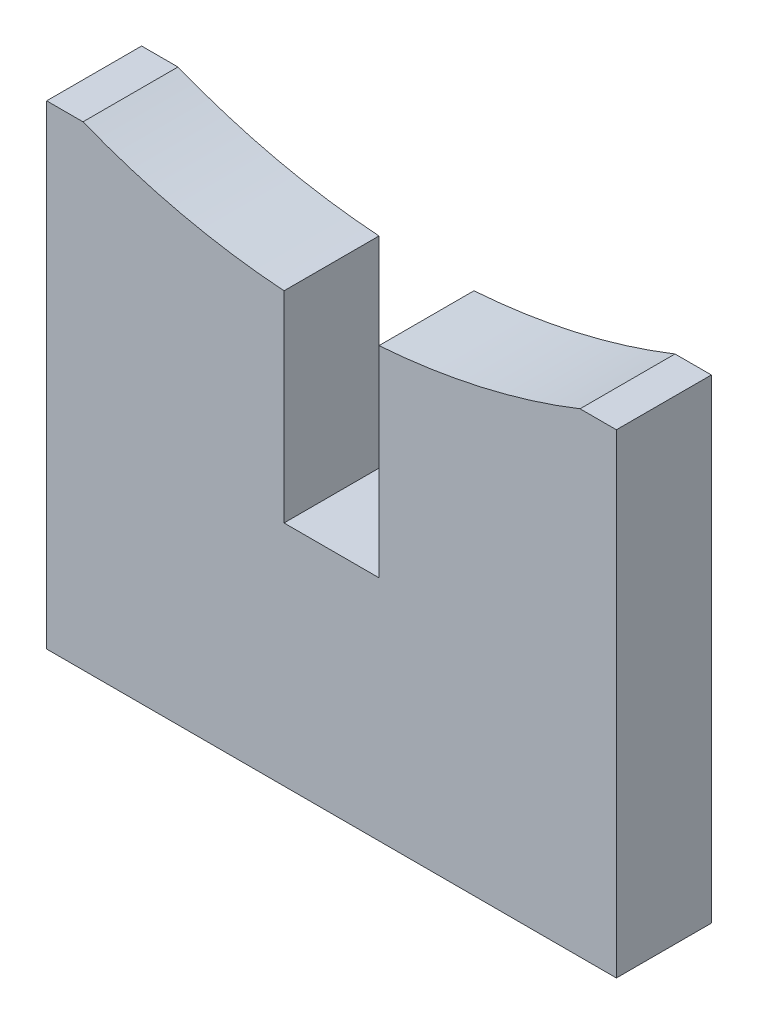
ISO-10303-21;
HEADER;
FILE_DESCRIPTION(('STEP AP214'),'2;1');
FILE_NAME('part.step','',(''),(''),'','','');
FILE_SCHEMA(('AUTOMOTIVE_DESIGN { 1 0 10303 214 1 1 1 1 }'));
ENDSEC;
DATA;
#1=APPLICATION_CONTEXT('core data for automotive mechanical design processes');
#2=APPLICATION_PROTOCOL_DEFINITION('international standard','automotive_design',2000,#1);
#3=PRODUCT_CONTEXT('',#1,'mechanical');
#4=PRODUCT('Part','Part','',(#3));
#5=PRODUCT_RELATED_PRODUCT_CATEGORY('part','',(#4));
#6=PRODUCT_DEFINITION_FORMATION('','',#4);
#7=PRODUCT_DEFINITION_CONTEXT('part definition',#1,'design');
#8=PRODUCT_DEFINITION('design','',#6,#7);
#9=PRODUCT_DEFINITION_SHAPE('','',#8);
#10=(LENGTH_UNIT() NAMED_UNIT(*) SI_UNIT(.MILLI.,.METRE.));
#11=(NAMED_UNIT(*) PLANE_ANGLE_UNIT() SI_UNIT($,.RADIAN.));
#12=(NAMED_UNIT(*) SI_UNIT($,.STERADIAN.) SOLID_ANGLE_UNIT());
#13=UNCERTAINTY_MEASURE_WITH_UNIT(LENGTH_MEASURE(1.E-05),#10,'distance_accuracy_value','');
#14=(GEOMETRIC_REPRESENTATION_CONTEXT(3) GLOBAL_UNCERTAINTY_ASSIGNED_CONTEXT((#13)) GLOBAL_UNIT_ASSIGNED_CONTEXT((#10,
#11,#12)) REPRESENTATION_CONTEXT('',''));
#15=CARTESIAN_POINT('',(0.,0.,0.));
#16=DIRECTION('',(0.,0.,1.));
#17=DIRECTION('',(1.,0.,0.));
#18=AXIS2_PLACEMENT_3D('',#15,#16,#17);
#19=CARTESIAN_POINT('',(0.,25.,5.));
#20=DIRECTION('',(0.,-1.,0.));
#21=DIRECTION('',(0.,0.,-1.));
#22=AXIS2_PLACEMENT_3D('',#19,#20,#21);
#23=PLANE('',#22);
#24=DIRECTION('',(-1.,0.,0.));
#25=VECTOR('',#24,1.);
#26=CARTESIAN_POINT('',(0.,25.,5.));
#27=LINE('',#26,#25);
#28=CARTESIAN_POINT('',(1.91374767169757,25.,5.));
#29=VERTEX_POINT('',#28);
#30=CARTESIAN_POINT('',(0.,25.,5.));
#31=VERTEX_POINT('',#30);
#32=EDGE_CURVE('E120',#29,#31,#27,.T.);
#33=ORIENTED_EDGE('',*,*,#32,.F.);
#34=DIRECTION('',(0.,0.,1.));
#35=VECTOR('',#34,1.);
#36=CARTESIAN_POINT('',(1.91374767169757,25.,-26.));
#37=LINE('',#36,#35);
#38=CARTESIAN_POINT('',(1.91374767169757,25.,0.));
#39=VERTEX_POINT('',#38);
#40=EDGE_CURVE('E106',#29,#39,#37,.F.);
#41=ORIENTED_EDGE('',*,*,#40,.T.);
#42=DIRECTION('',(-1.,0.,0.));
#43=VECTOR('',#42,1.);
#44=CARTESIAN_POINT('',(0.,25.,0.));
#45=LINE('',#44,#43);
#46=CARTESIAN_POINT('',(0.,25.,0.));
#47=VERTEX_POINT('',#46);
#48=EDGE_CURVE('E143',#39,#47,#45,.T.);
#49=ORIENTED_EDGE('',*,*,#48,.T.);
#50=DIRECTION('',(0.,0.,-1.));
#51=VECTOR('',#50,1.);
#52=CARTESIAN_POINT('',(0.,25.,5.));
#53=LINE('',#52,#51);
#54=EDGE_CURVE('E126',#31,#47,#53,.T.);
#55=ORIENTED_EDGE('',*,*,#54,.F.);
#56=EDGE_LOOP('',(#33,#41,#49,#55));
#57=FACE_BOUND('',#56,.T.);
#58=ADVANCED_FACE('F32',(#57),#23,.F.);
#59=CARTESIAN_POINT('',(0.,0.,5.));
#60=DIRECTION('',(1.,0.,0.));
#61=DIRECTION('',(0.,0.,-1.));
#62=AXIS2_PLACEMENT_3D('',#59,#60,#61);
#63=PLANE('',#62);
#64=DIRECTION('',(0.,-1.,0.));
#65=VECTOR('',#64,1.);
#66=CARTESIAN_POINT('',(0.,0.,0.));
#67=LINE('',#66,#65);
#68=CARTESIAN_POINT('',(0.,0.,0.));
#69=VERTEX_POINT('',#68);
#70=EDGE_CURVE('E135',#47,#69,#67,.T.);
#71=ORIENTED_EDGE('',*,*,#70,.T.);
#72=DIRECTION('',(0.,0.,-1.));
#73=VECTOR('',#72,1.);
#74=CARTESIAN_POINT('',(0.,0.,5.));
#75=LINE('',#74,#73);
#76=CARTESIAN_POINT('',(0.,0.,5.));
#77=VERTEX_POINT('',#76);
#78=EDGE_CURVE('E155',#77,#69,#75,.T.);
#79=ORIENTED_EDGE('',*,*,#78,.F.);
#80=DIRECTION('',(0.,-1.,0.));
#81=VECTOR('',#80,1.);
#82=CARTESIAN_POINT('',(0.,0.,5.));
#83=LINE('',#82,#81);
#84=EDGE_CURVE('E147',#31,#77,#83,.T.);
#85=ORIENTED_EDGE('',*,*,#84,.F.);
#86=ORIENTED_EDGE('',*,*,#54,.T.);
#87=EDGE_LOOP('',(#71,#79,#85,#86));
#88=FACE_BOUND('',#87,.T.);
#89=ADVANCED_FACE('F34',(#88),#63,.F.);
#90=CARTESIAN_POINT('',(0.,0.,5.));
#91=DIRECTION('',(0.,1.,0.));
#92=DIRECTION('',(0.,0.,1.));
#93=AXIS2_PLACEMENT_3D('',#90,#91,#92);
#94=PLANE('',#93);
#95=DIRECTION('',(1.,0.,0.));
#96=VECTOR('',#95,1.);
#97=CARTESIAN_POINT('',(0.,0.,0.));
#98=LINE('',#97,#96);
#99=CARTESIAN_POINT('',(30.,0.,0.));
#100=VERTEX_POINT('',#99);
#101=EDGE_CURVE('E138',#69,#100,#98,.T.);
#102=ORIENTED_EDGE('',*,*,#101,.T.);
#103=DIRECTION('',(0.,0.,-1.));
#104=VECTOR('',#103,1.);
#105=CARTESIAN_POINT('',(30.,0.,5.));
#106=LINE('',#105,#104);
#107=CARTESIAN_POINT('',(30.,0.,5.));
#108=VERTEX_POINT('',#107);
#109=EDGE_CURVE('E152',#108,#100,#106,.T.);
#110=ORIENTED_EDGE('',*,*,#109,.F.);
#111=DIRECTION('',(1.,0.,0.));
#112=VECTOR('',#111,1.);
#113=CARTESIAN_POINT('',(0.,0.,5.));
#114=LINE('',#113,#112);
#115=EDGE_CURVE('E131',#77,#108,#114,.T.);
#116=ORIENTED_EDGE('',*,*,#115,.F.);
#117=ORIENTED_EDGE('',*,*,#78,.T.);
#118=EDGE_LOOP('',(#102,#110,#116,#117));
#119=FACE_BOUND('',#118,.T.);
#120=ADVANCED_FACE('F196',(#119),#94,.F.);
#121=CARTESIAN_POINT('',(30.,0.,5.));
#122=DIRECTION('',(-1.,0.,0.));
#123=DIRECTION('',(0.,0.,1.));
#124=AXIS2_PLACEMENT_3D('',#121,#122,#123);
#125=PLANE('',#124);
#126=DIRECTION('',(0.,1.,0.));
#127=VECTOR('',#126,1.);
#128=CARTESIAN_POINT('',(30.,0.,0.));
#129=LINE('',#128,#127);
#130=CARTESIAN_POINT('',(30.,25.,0.));
#131=VERTEX_POINT('',#130);
#132=EDGE_CURVE('E141',#100,#131,#129,.T.);
#133=ORIENTED_EDGE('',*,*,#132,.T.);
#134=DIRECTION('',(0.,0.,-1.));
#135=VECTOR('',#134,1.);
#136=CARTESIAN_POINT('',(30.,25.,5.));
#137=LINE('',#136,#135);
#138=CARTESIAN_POINT('',(30.,25.,5.));
#139=VERTEX_POINT('',#138);
#140=EDGE_CURVE('E149',#139,#131,#137,.T.);
#141=ORIENTED_EDGE('',*,*,#140,.F.);
#142=DIRECTION('',(0.,1.,0.));
#143=VECTOR('',#142,1.);
#144=CARTESIAN_POINT('',(30.,0.,5.));
#145=LINE('',#144,#143);
#146=EDGE_CURVE('E129',#108,#139,#145,.T.);
#147=ORIENTED_EDGE('',*,*,#146,.F.);
#148=ORIENTED_EDGE('',*,*,#109,.T.);
#149=EDGE_LOOP('',(#133,#141,#147,#148));
#150=FACE_BOUND('',#149,.T.);
#151=ADVANCED_FACE('F199',(#150),#125,.F.);
#152=CARTESIAN_POINT('',(28.0862523283024,25.,0.));
#153=VERTEX_POINT('',#152);
#154=EDGE_CURVE('E144',#131,#153,#45,.T.);
#155=ORIENTED_EDGE('',*,*,#154,.T.);
#156=DIRECTION('',(0.,0.,1.));
#157=VECTOR('',#156,1.);
#158=CARTESIAN_POINT('',(28.0862523283024,25.,-26.));
#159=LINE('',#158,#157);
#160=CARTESIAN_POINT('',(28.0862523283024,25.,5.));
#161=VERTEX_POINT('',#160);
#162=EDGE_CURVE('E175',#153,#161,#159,.T.);
#163=ORIENTED_EDGE('',*,*,#162,.T.);
#164=EDGE_CURVE('E128',#139,#161,#27,.T.);
#165=ORIENTED_EDGE('',*,*,#164,.F.);
#166=ORIENTED_EDGE('',*,*,#140,.T.);
#167=EDGE_LOOP('',(#155,#163,#165,#166));
#168=FACE_BOUND('',#167,.T.);
#169=ADVANCED_FACE('F201',(#168),#23,.F.);
#170=CARTESIAN_POINT('',(0.,0.,5.));
#171=DIRECTION('',(0.,0.,-1.));
#172=DIRECTION('',(-1.,0.,0.));
#173=AXIS2_PLACEMENT_3D('',#170,#171,#172);
#174=PLANE('',#173);
#175=ORIENTED_EDGE('',*,*,#164,.T.);
#176=CARTESIAN_POINT('',(15.,58.,5.));
#177=DIRECTION('',(0.,0.,1.));
#178=DIRECTION('',(1.,0.,0.));
#179=AXIS2_PLACEMENT_3D('',#176,#177,#178);
#180=CIRCLE('',#179,35.5);
#181=CARTESIAN_POINT('',(17.5,22.5881375807484,5.));
#182=VERTEX_POINT('',#181);
#183=EDGE_CURVE('E123',#182,#161,#180,.T.);
#184=ORIENTED_EDGE('',*,*,#183,.F.);
#185=DIRECTION('',(0.,1.,0.));
#186=VECTOR('',#185,1.);
#187=CARTESIAN_POINT('',(17.5,25.,5.));
#188=LINE('',#187,#186);
#189=CARTESIAN_POINT('',(17.5,12.,5.));
#190=VERTEX_POINT('',#189);
#191=EDGE_CURVE('E186',#190,#182,#188,.T.);
#192=ORIENTED_EDGE('',*,*,#191,.F.);
#193=DIRECTION('',(1.,0.,0.));
#194=VECTOR('',#193,1.);
#195=CARTESIAN_POINT('',(12.5,12.,5.));
#196=LINE('',#195,#194);
#197=CARTESIAN_POINT('',(12.5,12.,5.));
#198=VERTEX_POINT('',#197);
#199=EDGE_CURVE('E183',#198,#190,#196,.T.);
#200=ORIENTED_EDGE('',*,*,#199,.F.);
#201=DIRECTION('',(0.,-1.,0.));
#202=VECTOR('',#201,1.);
#203=CARTESIAN_POINT('',(12.5,25.,5.));
#204=LINE('',#203,#202);
#205=CARTESIAN_POINT('',(12.5,22.5881375807484,5.));
#206=VERTEX_POINT('',#205);
#207=EDGE_CURVE('E113',#206,#198,#204,.T.);
#208=ORIENTED_EDGE('',*,*,#207,.F.);
#209=EDGE_CURVE('E47',#29,#206,#180,.T.);
#210=ORIENTED_EDGE('',*,*,#209,.F.);
#211=ORIENTED_EDGE('',*,*,#32,.T.);
#212=ORIENTED_EDGE('',*,*,#84,.T.);
#213=ORIENTED_EDGE('',*,*,#115,.T.);
#214=ORIENTED_EDGE('',*,*,#146,.T.);
#215=EDGE_LOOP('',(#175,#184,#192,#200,#208,#210,#211,#212,#213,#214));
#216=FACE_BOUND('',#215,.T.);
#217=ADVANCED_FACE('F118',(#216),#174,.F.);
#218=CARTESIAN_POINT('',(0.,0.,0.));
#219=DIRECTION('',(0.,0.,-1.));
#220=DIRECTION('',(-1.,0.,0.));
#221=AXIS2_PLACEMENT_3D('',#218,#219,#220);
#222=PLANE('',#221);
#223=CARTESIAN_POINT('',(15.,58.,0.));
#224=DIRECTION('',(0.,0.,-1.));
#225=DIRECTION('',(-1.,0.,0.));
#226=AXIS2_PLACEMENT_3D('',#223,#224,#225);
#227=CIRCLE('',#226,35.5);
#228=CARTESIAN_POINT('',(17.5,22.5881375807484,0.));
#229=VERTEX_POINT('',#228);
#230=EDGE_CURVE('E55',#153,#229,#227,.T.);
#231=ORIENTED_EDGE('',*,*,#230,.F.);
#232=ORIENTED_EDGE('',*,*,#154,.F.);
#233=ORIENTED_EDGE('',*,*,#132,.F.);
#234=ORIENTED_EDGE('',*,*,#101,.F.);
#235=ORIENTED_EDGE('',*,*,#70,.F.);
#236=ORIENTED_EDGE('',*,*,#48,.F.);
#237=CARTESIAN_POINT('',(12.5,22.5881375807484,0.));
#238=VERTEX_POINT('',#237);
#239=EDGE_CURVE('E109',#238,#39,#227,.T.);
#240=ORIENTED_EDGE('',*,*,#239,.F.);
#241=DIRECTION('',(0.,1.,0.));
#242=VECTOR('',#241,1.);
#243=CARTESIAN_POINT('',(12.5,0.,0.));
#244=LINE('',#243,#242);
#245=CARTESIAN_POINT('',(12.5,12.,0.));
#246=VERTEX_POINT('',#245);
#247=EDGE_CURVE('E40',#246,#238,#244,.T.);
#248=ORIENTED_EDGE('',*,*,#247,.F.);
#249=DIRECTION('',(-1.,0.,0.));
#250=VECTOR('',#249,1.);
#251=CARTESIAN_POINT('',(0.,12.,0.));
#252=LINE('',#251,#250);
#253=CARTESIAN_POINT('',(17.5,12.,0.));
#254=VERTEX_POINT('',#253);
#255=EDGE_CURVE('E158',#254,#246,#252,.T.);
#256=ORIENTED_EDGE('',*,*,#255,.F.);
#257=DIRECTION('',(0.,-1.,0.));
#258=VECTOR('',#257,1.);
#259=CARTESIAN_POINT('',(17.5,0.,0.));
#260=LINE('',#259,#258);
#261=EDGE_CURVE('E160',#229,#254,#260,.T.);
#262=ORIENTED_EDGE('',*,*,#261,.F.);
#263=EDGE_LOOP('',(#231,#232,#233,#234,#235,#236,#240,#248,#256,#262));
#264=FACE_BOUND('',#263,.T.);
#265=ADVANCED_FACE('F171',(#264),#222,.T.);
#266=CARTESIAN_POINT('',(12.5,25.,-16.));
#267=DIRECTION('',(-1.,0.,0.));
#268=DIRECTION('',(0.,0.,1.));
#269=AXIS2_PLACEMENT_3D('',#266,#267,#268);
#270=PLANE('',#269);
#271=ORIENTED_EDGE('',*,*,#247,.T.);
#272=DIRECTION('',(0.,0.,1.));
#273=VECTOR('',#272,1.);
#274=CARTESIAN_POINT('',(12.5,22.5881375807484,-26.));
#275=LINE('',#274,#273);
#276=EDGE_CURVE('E166',#238,#206,#275,.T.);
#277=ORIENTED_EDGE('',*,*,#276,.T.);
#278=ORIENTED_EDGE('',*,*,#207,.T.);
#279=DIRECTION('',(0.,0.,1.));
#280=VECTOR('',#279,1.);
#281=CARTESIAN_POINT('',(12.5,12.,-16.));
#282=LINE('',#281,#280);
#283=EDGE_CURVE('E168',#246,#198,#282,.T.);
#284=ORIENTED_EDGE('',*,*,#283,.F.);
#285=EDGE_LOOP('',(#271,#277,#278,#284));
#286=FACE_BOUND('',#285,.T.);
#287=ADVANCED_FACE('F165',(#286),#270,.F.);
#288=CARTESIAN_POINT('',(17.5,25.,-16.));
#289=DIRECTION('',(1.,0.,0.));
#290=DIRECTION('',(0.,1.,0.));
#291=AXIS2_PLACEMENT_3D('',#288,#289,#290);
#292=PLANE('',#291);
#293=ORIENTED_EDGE('',*,*,#191,.T.);
#294=DIRECTION('',(0.,0.,1.));
#295=VECTOR('',#294,1.);
#296=CARTESIAN_POINT('',(17.5,22.5881375807484,-26.));
#297=LINE('',#296,#295);
#298=EDGE_CURVE('E11',#182,#229,#297,.F.);
#299=ORIENTED_EDGE('',*,*,#298,.T.);
#300=ORIENTED_EDGE('',*,*,#261,.T.);
#301=DIRECTION('',(0.,0.,1.));
#302=VECTOR('',#301,1.);
#303=CARTESIAN_POINT('',(17.5,12.,-16.));
#304=LINE('',#303,#302);
#305=EDGE_CURVE('E139',#254,#190,#304,.T.);
#306=ORIENTED_EDGE('',*,*,#305,.T.);
#307=EDGE_LOOP('',(#293,#299,#300,#306));
#308=FACE_BOUND('',#307,.T.);
#309=ADVANCED_FACE('F205',(#308),#292,.F.);
#310=CARTESIAN_POINT('',(12.5,12.,-16.));
#311=DIRECTION('',(0.,-1.,0.));
#312=DIRECTION('',(0.,0.,-1.));
#313=AXIS2_PLACEMENT_3D('',#310,#311,#312);
#314=PLANE('',#313);
#315=ORIENTED_EDGE('',*,*,#255,.T.);
#316=ORIENTED_EDGE('',*,*,#283,.T.);
#317=ORIENTED_EDGE('',*,*,#199,.T.);
#318=ORIENTED_EDGE('',*,*,#305,.F.);
#319=EDGE_LOOP('',(#315,#316,#317,#318));
#320=FACE_BOUND('',#319,.T.);
#321=ADVANCED_FACE('F208',(#320),#314,.F.);
#322=CARTESIAN_POINT('',(15.,58.,-26.));
#323=DIRECTION('',(0.,0.,1.));
#324=DIRECTION('',(1.,0.,0.));
#325=AXIS2_PLACEMENT_3D('',#322,#323,#324);
#326=CYLINDRICAL_SURFACE('',#325,35.5);
#327=ORIENTED_EDGE('',*,*,#230,.T.);
#328=ORIENTED_EDGE('',*,*,#298,.F.);
#329=ORIENTED_EDGE('',*,*,#183,.T.);
#330=ORIENTED_EDGE('',*,*,#162,.F.);
#331=EDGE_LOOP('',(#327,#328,#329,#330));
#332=FACE_BOUND('',#331,.T.);
#333=ADVANCED_FACE('F210',(#332),#326,.F.);
#334=ORIENTED_EDGE('',*,*,#209,.T.);
#335=ORIENTED_EDGE('',*,*,#276,.F.);
#336=ORIENTED_EDGE('',*,*,#239,.T.);
#337=ORIENTED_EDGE('',*,*,#40,.F.);
#338=EDGE_LOOP('',(#334,#335,#336,#337));
#339=FACE_BOUND('',#338,.T.);
#340=ADVANCED_FACE('F107',(#339),#326,.F.);
#341=CLOSED_SHELL('',(#58,#89,#120,#151,#169,#217,#265,#287,#309,#321,#333,#340));
#342=MANIFOLD_SOLID_BREP('B2',#341);
#343=ADVANCED_BREP_SHAPE_REPRESENTATION('',(#18,#342),#14);
#344=SHAPE_DEFINITION_REPRESENTATION(#9,#343);
ENDSEC;
END-ISO-10303-21;
